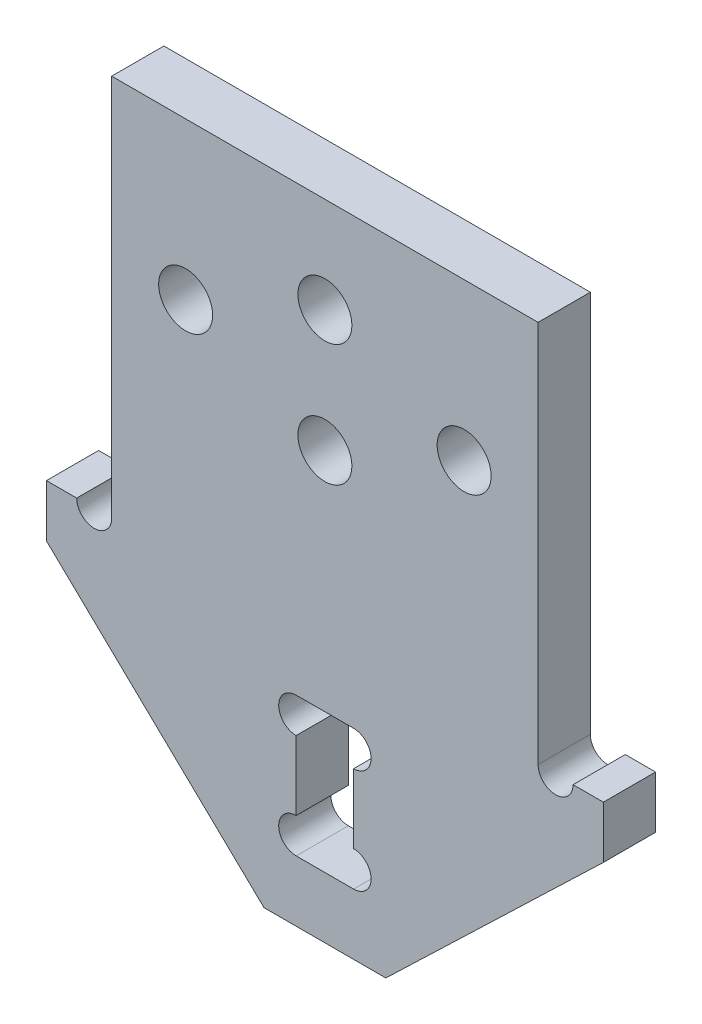
ISO-10303-21;
HEADER;
FILE_DESCRIPTION(('STEP AP214'),'2;1');
FILE_NAME('part.step','',(''),(''),'','','');
FILE_SCHEMA(('AUTOMOTIVE_DESIGN { 1 0 10303 214 1 1 1 1 }'));
ENDSEC;
DATA;
#1=APPLICATION_CONTEXT('core data for automotive mechanical design processes');
#2=APPLICATION_PROTOCOL_DEFINITION('international standard','automotive_design',2000,#1);
#3=PRODUCT_CONTEXT('',#1,'mechanical');
#4=PRODUCT('Part','Part','',(#3));
#5=PRODUCT_RELATED_PRODUCT_CATEGORY('part','',(#4));
#6=PRODUCT_DEFINITION_FORMATION('','',#4);
#7=PRODUCT_DEFINITION_CONTEXT('part definition',#1,'design');
#8=PRODUCT_DEFINITION('design','',#6,#7);
#9=PRODUCT_DEFINITION_SHAPE('','',#8);
#10=(LENGTH_UNIT() NAMED_UNIT(*) SI_UNIT(.MILLI.,.METRE.));
#11=(NAMED_UNIT(*) PLANE_ANGLE_UNIT() SI_UNIT($,.RADIAN.));
#12=(NAMED_UNIT(*) SI_UNIT($,.STERADIAN.) SOLID_ANGLE_UNIT());
#13=UNCERTAINTY_MEASURE_WITH_UNIT(LENGTH_MEASURE(1.E-05),#10,'distance_accuracy_value','');
#14=(GEOMETRIC_REPRESENTATION_CONTEXT(3) GLOBAL_UNCERTAINTY_ASSIGNED_CONTEXT((#13)) GLOBAL_UNIT_ASSIGNED_CONTEXT((#10,
#11,#12)) REPRESENTATION_CONTEXT('',''));
#15=CARTESIAN_POINT('',(0.,0.,0.));
#16=DIRECTION('',(0.,0.,1.));
#17=DIRECTION('',(1.,0.,0.));
#18=AXIS2_PLACEMENT_3D('',#15,#16,#17);
#19=CARTESIAN_POINT('',(13.255,-11.,3.));
#20=DIRECTION('',(0.,0.,-1.));
#21=DIRECTION('',(-1.,0.,0.));
#22=AXIS2_PLACEMENT_3D('',#19,#20,#21);
#23=CYLINDRICAL_SURFACE('',#22,1.005);
#24=CARTESIAN_POINT('',(13.255,-11.,0.));
#25=DIRECTION('',(0.,0.,1.));
#26=DIRECTION('',(1.,0.,0.));
#27=AXIS2_PLACEMENT_3D('',#24,#25,#26);
#28=CIRCLE('',#27,1.005);
#29=CARTESIAN_POINT('',(12.25,-11.,0.));
#30=VERTEX_POINT('',#29);
#31=CARTESIAN_POINT('',(14.26,-11.,0.));
#32=VERTEX_POINT('',#31);
#33=EDGE_CURVE('E387',#30,#32,#28,.T.);
#34=ORIENTED_EDGE('',*,*,#33,.F.);
#35=DIRECTION('',(0.,0.,-1.));
#36=VECTOR('',#35,1.);
#37=CARTESIAN_POINT('',(12.25,-11.,3.));
#38=LINE('',#37,#36);
#39=CARTESIAN_POINT('',(12.25,-11.,3.));
#40=VERTEX_POINT('',#39);
#41=EDGE_CURVE('E12',#40,#30,#38,.T.);
#42=ORIENTED_EDGE('',*,*,#41,.F.);
#43=CARTESIAN_POINT('',(13.255,-11.,3.));
#44=DIRECTION('',(0.,0.,1.));
#45=DIRECTION('',(1.,0.,0.));
#46=AXIS2_PLACEMENT_3D('',#43,#44,#45);
#47=CIRCLE('',#46,1.005);
#48=CARTESIAN_POINT('',(14.26,-11.,3.));
#49=VERTEX_POINT('',#48);
#50=EDGE_CURVE('E244',#40,#49,#47,.T.);
#51=ORIENTED_EDGE('',*,*,#50,.T.);
#52=DIRECTION('',(0.,0.,-1.));
#53=VECTOR('',#52,1.);
#54=CARTESIAN_POINT('',(14.26,-11.,3.));
#55=LINE('',#54,#53);
#56=EDGE_CURVE('E56',#49,#32,#55,.T.);
#57=ORIENTED_EDGE('',*,*,#56,.T.);
#58=EDGE_LOOP('',(#34,#42,#51,#57));
#59=FACE_BOUND('',#58,.T.);
#60=ADVANCED_FACE('F37',(#59),#23,.F.);
#61=CARTESIAN_POINT('',(12.25,0.,3.));
#62=DIRECTION('',(-1.,0.,0.));
#63=DIRECTION('',(0.,-1.,0.));
#64=AXIS2_PLACEMENT_3D('',#61,#62,#63);
#65=PLANE('',#64);
#66=DIRECTION('',(0.,1.,0.));
#67=VECTOR('',#66,1.);
#68=CARTESIAN_POINT('',(12.25,0.,0.));
#69=LINE('',#68,#67);
#70=CARTESIAN_POINT('',(12.25,11.,0.));
#71=VERTEX_POINT('',#70);
#72=EDGE_CURVE('E389',#30,#71,#69,.T.);
#73=ORIENTED_EDGE('',*,*,#72,.T.);
#74=DIRECTION('',(0.,0.,-1.));
#75=VECTOR('',#74,1.);
#76=CARTESIAN_POINT('',(12.25,11.,3.));
#77=LINE('',#76,#75);
#78=CARTESIAN_POINT('',(12.25,11.,3.));
#79=VERTEX_POINT('',#78);
#80=EDGE_CURVE('E47',#79,#71,#77,.T.);
#81=ORIENTED_EDGE('',*,*,#80,.F.);
#82=DIRECTION('',(0.,1.,0.));
#83=VECTOR('',#82,1.);
#84=CARTESIAN_POINT('',(12.25,0.,3.));
#85=LINE('',#84,#83);
#86=EDGE_CURVE('E240',#40,#79,#85,.T.);
#87=ORIENTED_EDGE('',*,*,#86,.F.);
#88=ORIENTED_EDGE('',*,*,#41,.T.);
#89=EDGE_LOOP('',(#73,#81,#87,#88));
#90=FACE_BOUND('',#89,.T.);
#91=ADVANCED_FACE('F440',(#90),#65,.F.);
#92=CARTESIAN_POINT('',(0.,11.,3.));
#93=DIRECTION('',(0.,-1.,0.));
#94=DIRECTION('',(1.,0.,0.));
#95=AXIS2_PLACEMENT_3D('',#92,#93,#94);
#96=PLANE('',#95);
#97=DIRECTION('',(-1.,0.,0.));
#98=VECTOR('',#97,1.);
#99=CARTESIAN_POINT('',(0.,11.,0.));
#100=LINE('',#99,#98);
#101=CARTESIAN_POINT('',(-12.25,11.,0.));
#102=VERTEX_POINT('',#101);
#103=EDGE_CURVE('E392',#71,#102,#100,.T.);
#104=ORIENTED_EDGE('',*,*,#103,.T.);
#105=DIRECTION('',(0.,0.,-1.));
#106=VECTOR('',#105,1.);
#107=CARTESIAN_POINT('',(-12.25,11.,3.));
#108=LINE('',#107,#106);
#109=CARTESIAN_POINT('',(-12.25,11.,3.));
#110=VERTEX_POINT('',#109);
#111=EDGE_CURVE('E329',#110,#102,#108,.T.);
#112=ORIENTED_EDGE('',*,*,#111,.F.);
#113=DIRECTION('',(-1.,0.,0.));
#114=VECTOR('',#113,1.);
#115=CARTESIAN_POINT('',(0.,11.,3.));
#116=LINE('',#115,#114);
#117=EDGE_CURVE('E237',#79,#110,#116,.T.);
#118=ORIENTED_EDGE('',*,*,#117,.F.);
#119=ORIENTED_EDGE('',*,*,#80,.T.);
#120=EDGE_LOOP('',(#104,#112,#118,#119));
#121=FACE_BOUND('',#120,.T.);
#122=ADVANCED_FACE('F437',(#121),#96,.F.);
#123=CARTESIAN_POINT('',(-12.25,0.,3.));
#124=DIRECTION('',(-1.,0.,0.));
#125=DIRECTION('',(0.,0.,1.));
#126=AXIS2_PLACEMENT_3D('',#123,#124,#125);
#127=PLANE('',#126);
#128=DIRECTION('',(0.,1.,0.));
#129=VECTOR('',#128,1.);
#130=CARTESIAN_POINT('',(-12.25,0.,0.));
#131=LINE('',#130,#129);
#132=CARTESIAN_POINT('',(-12.25,-11.,0.));
#133=VERTEX_POINT('',#132);
#134=EDGE_CURVE('E395',#133,#102,#131,.T.);
#135=ORIENTED_EDGE('',*,*,#134,.F.);
#136=DIRECTION('',(0.,0.,-1.));
#137=VECTOR('',#136,1.);
#138=CARTESIAN_POINT('',(-12.25,-11.,3.));
#139=LINE('',#138,#137);
#140=CARTESIAN_POINT('',(-12.25,-11.,3.));
#141=VERTEX_POINT('',#140);
#142=EDGE_CURVE('E327',#141,#133,#139,.T.);
#143=ORIENTED_EDGE('',*,*,#142,.F.);
#144=DIRECTION('',(0.,1.,0.));
#145=VECTOR('',#144,1.);
#146=CARTESIAN_POINT('',(-12.25,0.,3.));
#147=LINE('',#146,#145);
#148=EDGE_CURVE('E234',#141,#110,#147,.T.);
#149=ORIENTED_EDGE('',*,*,#148,.T.);
#150=ORIENTED_EDGE('',*,*,#111,.T.);
#151=EDGE_LOOP('',(#135,#143,#149,#150));
#152=FACE_BOUND('',#151,.T.);
#153=ADVANCED_FACE('F432',(#152),#127,.T.);
#154=CARTESIAN_POINT('',(-13.255,-11.,3.));
#155=DIRECTION('',(0.,0.,-1.));
#156=DIRECTION('',(-1.,0.,0.));
#157=AXIS2_PLACEMENT_3D('',#154,#155,#156);
#158=CYLINDRICAL_SURFACE('',#157,1.005);
#159=CARTESIAN_POINT('',(-13.255,-11.,0.));
#160=DIRECTION('',(0.,0.,1.));
#161=DIRECTION('',(1.,0.,0.));
#162=AXIS2_PLACEMENT_3D('',#159,#160,#161);
#163=CIRCLE('',#162,1.005);
#164=CARTESIAN_POINT('',(-14.26,-11.,0.));
#165=VERTEX_POINT('',#164);
#166=EDGE_CURVE('E398',#165,#133,#163,.T.);
#167=ORIENTED_EDGE('',*,*,#166,.F.);
#168=DIRECTION('',(0.,0.,-1.));
#169=VECTOR('',#168,1.);
#170=CARTESIAN_POINT('',(-14.26,-11.,3.));
#171=LINE('',#170,#169);
#172=CARTESIAN_POINT('',(-14.26,-11.,3.));
#173=VERTEX_POINT('',#172);
#174=EDGE_CURVE('E325',#173,#165,#171,.T.);
#175=ORIENTED_EDGE('',*,*,#174,.F.);
#176=CARTESIAN_POINT('',(-13.255,-11.,3.));
#177=DIRECTION('',(0.,0.,1.));
#178=DIRECTION('',(1.,0.,0.));
#179=AXIS2_PLACEMENT_3D('',#176,#177,#178);
#180=CIRCLE('',#179,1.005);
#181=EDGE_CURVE('E226',#173,#141,#180,.T.);
#182=ORIENTED_EDGE('',*,*,#181,.T.);
#183=ORIENTED_EDGE('',*,*,#142,.T.);
#184=EDGE_LOOP('',(#167,#175,#182,#183));
#185=FACE_BOUND('',#184,.T.);
#186=ADVANCED_FACE('F425',(#185),#158,.F.);
#187=CARTESIAN_POINT('',(0.,-11.,3.));
#188=DIRECTION('',(0.,-1.,0.));
#189=DIRECTION('',(0.,0.,-1.));
#190=AXIS2_PLACEMENT_3D('',#187,#188,#189);
#191=PLANE('',#190);
#192=DIRECTION('',(-1.,0.,0.));
#193=VECTOR('',#192,1.);
#194=CARTESIAN_POINT('',(0.,-11.,0.));
#195=LINE('',#194,#193);
#196=CARTESIAN_POINT('',(-16.,-11.,0.));
#197=VERTEX_POINT('',#196);
#198=EDGE_CURVE('E401',#165,#197,#195,.T.);
#199=ORIENTED_EDGE('',*,*,#198,.T.);
#200=DIRECTION('',(0.,0.,-1.));
#201=VECTOR('',#200,1.);
#202=CARTESIAN_POINT('',(-16.,-11.,3.));
#203=LINE('',#202,#201);
#204=CARTESIAN_POINT('',(-16.,-11.,3.));
#205=VERTEX_POINT('',#204);
#206=EDGE_CURVE('E322',#205,#197,#203,.T.);
#207=ORIENTED_EDGE('',*,*,#206,.F.);
#208=DIRECTION('',(-1.,0.,0.));
#209=VECTOR('',#208,1.);
#210=CARTESIAN_POINT('',(0.,-11.,3.));
#211=LINE('',#210,#209);
#212=EDGE_CURVE('E222',#173,#205,#211,.T.);
#213=ORIENTED_EDGE('',*,*,#212,.F.);
#214=ORIENTED_EDGE('',*,*,#174,.T.);
#215=EDGE_LOOP('',(#199,#207,#213,#214));
#216=FACE_BOUND('',#215,.T.);
#217=ADVANCED_FACE('F511',(#216),#191,.F.);
#218=CARTESIAN_POINT('',(-16.,0.,3.));
#219=DIRECTION('',(1.,0.,0.));
#220=DIRECTION('',(0.,0.,-1.));
#221=AXIS2_PLACEMENT_3D('',#218,#219,#220);
#222=PLANE('',#221);
#223=DIRECTION('',(0.,-1.,0.));
#224=VECTOR('',#223,1.);
#225=CARTESIAN_POINT('',(-16.,0.,0.));
#226=LINE('',#225,#224);
#227=CARTESIAN_POINT('',(-16.,-14.,0.));
#228=VERTEX_POINT('',#227);
#229=EDGE_CURVE('E404',#197,#228,#226,.T.);
#230=ORIENTED_EDGE('',*,*,#229,.T.);
#231=DIRECTION('',(0.,0.,-1.));
#232=VECTOR('',#231,1.);
#233=CARTESIAN_POINT('',(-16.,-14.,3.));
#234=LINE('',#233,#232);
#235=CARTESIAN_POINT('',(-16.,-14.,3.));
#236=VERTEX_POINT('',#235);
#237=EDGE_CURVE('E319',#236,#228,#234,.T.);
#238=ORIENTED_EDGE('',*,*,#237,.F.);
#239=DIRECTION('',(0.,-1.,0.));
#240=VECTOR('',#239,1.);
#241=CARTESIAN_POINT('',(-16.,0.,3.));
#242=LINE('',#241,#240);
#243=EDGE_CURVE('E218',#205,#236,#242,.T.);
#244=ORIENTED_EDGE('',*,*,#243,.F.);
#245=ORIENTED_EDGE('',*,*,#206,.T.);
#246=EDGE_LOOP('',(#230,#238,#244,#245));
#247=FACE_BOUND('',#246,.T.);
#248=ADVANCED_FACE('F419',(#247),#222,.F.);
#249=CARTESIAN_POINT('',(-14.6677768526228,-15.2789342214821,3.));
#250=DIRECTION('',(0.692531828189713,0.721387321030952,0.));
#251=DIRECTION('',(-0.721387321030952,0.692531828189713,0.));
#252=AXIS2_PLACEMENT_3D('',#249,#250,#251);
#253=PLANE('',#252);
#254=DIRECTION('',(0.721387321030952,-0.692531828189713,0.));
#255=VECTOR('',#254,1.);
#256=CARTESIAN_POINT('',(-14.6677768526228,-15.2789342214821,0.));
#257=LINE('',#256,#255);
#258=CARTESIAN_POINT('',(-3.49999999999999,-26.,0.));
#259=VERTEX_POINT('',#258);
#260=EDGE_CURVE('E407',#228,#259,#257,.T.);
#261=ORIENTED_EDGE('',*,*,#260,.T.);
#262=DIRECTION('',(0.,0.,-1.));
#263=VECTOR('',#262,1.);
#264=CARTESIAN_POINT('',(-3.49999999999999,-26.,3.));
#265=LINE('',#264,#263);
#266=CARTESIAN_POINT('',(-3.49999999999999,-26.,3.));
#267=VERTEX_POINT('',#266);
#268=EDGE_CURVE('E316',#267,#259,#265,.T.);
#269=ORIENTED_EDGE('',*,*,#268,.F.);
#270=DIRECTION('',(0.721387321030952,-0.692531828189713,0.));
#271=VECTOR('',#270,1.);
#272=CARTESIAN_POINT('',(-14.6677768526228,-15.2789342214821,3.));
#273=LINE('',#272,#271);
#274=EDGE_CURVE('E205',#236,#267,#273,.T.);
#275=ORIENTED_EDGE('',*,*,#274,.F.);
#276=ORIENTED_EDGE('',*,*,#237,.T.);
#277=EDGE_LOOP('',(#261,#269,#275,#276));
#278=FACE_BOUND('',#277,.T.);
#279=ADVANCED_FACE('F416',(#278),#253,.F.);
#280=CARTESIAN_POINT('',(0.,-26.,3.));
#281=DIRECTION('',(0.,1.,0.));
#282=DIRECTION('',(0.,0.,1.));
#283=AXIS2_PLACEMENT_3D('',#280,#281,#282);
#284=PLANE('',#283);
#285=DIRECTION('',(1.,0.,0.));
#286=VECTOR('',#285,1.);
#287=CARTESIAN_POINT('',(0.,-26.,0.));
#288=LINE('',#287,#286);
#289=CARTESIAN_POINT('',(3.5,-26.,0.));
#290=VERTEX_POINT('',#289);
#291=EDGE_CURVE('E410',#259,#290,#288,.T.);
#292=ORIENTED_EDGE('',*,*,#291,.T.);
#293=DIRECTION('',(0.,0.,-1.));
#294=VECTOR('',#293,1.);
#295=CARTESIAN_POINT('',(3.5,-26.,3.));
#296=LINE('',#295,#294);
#297=CARTESIAN_POINT('',(3.5,-26.,3.));
#298=VERTEX_POINT('',#297);
#299=EDGE_CURVE('E191',#298,#290,#296,.T.);
#300=ORIENTED_EDGE('',*,*,#299,.F.);
#301=DIRECTION('',(1.,0.,0.));
#302=VECTOR('',#301,1.);
#303=CARTESIAN_POINT('',(0.,-26.,3.));
#304=LINE('',#303,#302);
#305=EDGE_CURVE('E202',#267,#298,#304,.T.);
#306=ORIENTED_EDGE('',*,*,#305,.F.);
#307=ORIENTED_EDGE('',*,*,#268,.T.);
#308=EDGE_LOOP('',(#292,#300,#306,#307));
#309=FACE_BOUND('',#308,.T.);
#310=ADVANCED_FACE('F414',(#309),#284,.F.);
#311=CARTESIAN_POINT('',(14.6677768526228,-15.2789342214821,3.));
#312=DIRECTION('',(0.692531828189713,-0.721387321030951,0.));
#313=DIRECTION('',(0.721387321030952,0.692531828189713,0.));
#314=AXIS2_PLACEMENT_3D('',#311,#312,#313);
#315=PLANE('',#314);
#316=DIRECTION('',(-0.721387321030952,-0.692531828189713,0.));
#317=VECTOR('',#316,1.);
#318=CARTESIAN_POINT('',(14.6677768526228,-15.2789342214821,0.));
#319=LINE('',#318,#317);
#320=CARTESIAN_POINT('',(16.,-14.,0.));
#321=VERTEX_POINT('',#320);
#322=EDGE_CURVE('E188',#321,#290,#319,.T.);
#323=ORIENTED_EDGE('',*,*,#322,.F.);
#324=DIRECTION('',(0.,0.,-1.));
#325=VECTOR('',#324,1.);
#326=CARTESIAN_POINT('',(16.,-14.,3.));
#327=LINE('',#326,#325);
#328=CARTESIAN_POINT('',(16.,-14.,3.));
#329=VERTEX_POINT('',#328);
#330=EDGE_CURVE('E182',#329,#321,#327,.T.);
#331=ORIENTED_EDGE('',*,*,#330,.F.);
#332=DIRECTION('',(-0.721387321030952,-0.692531828189713,0.));
#333=VECTOR('',#332,1.);
#334=CARTESIAN_POINT('',(14.6677768526228,-15.2789342214821,3.));
#335=LINE('',#334,#333);
#336=EDGE_CURVE('E186',#329,#298,#335,.T.);
#337=ORIENTED_EDGE('',*,*,#336,.T.);
#338=ORIENTED_EDGE('',*,*,#299,.T.);
#339=EDGE_LOOP('',(#323,#331,#337,#338));
#340=FACE_BOUND('',#339,.T.);
#341=ADVANCED_FACE('F184',(#340),#315,.T.);
#342=CARTESIAN_POINT('',(16.,0.,3.));
#343=DIRECTION('',(-1.,0.,0.));
#344=DIRECTION('',(0.,0.,1.));
#345=AXIS2_PLACEMENT_3D('',#342,#343,#344);
#346=PLANE('',#345);
#347=DIRECTION('',(0.,1.,0.));
#348=VECTOR('',#347,1.);
#349=CARTESIAN_POINT('',(16.,0.,0.));
#350=LINE('',#349,#348);
#351=CARTESIAN_POINT('',(16.,-11.,0.));
#352=VERTEX_POINT('',#351);
#353=EDGE_CURVE('E307',#321,#352,#350,.T.);
#354=ORIENTED_EDGE('',*,*,#353,.T.);
#355=DIRECTION('',(0.,0.,-1.));
#356=VECTOR('',#355,1.);
#357=CARTESIAN_POINT('',(16.,-11.,3.));
#358=LINE('',#357,#356);
#359=CARTESIAN_POINT('',(16.,-11.,3.));
#360=VERTEX_POINT('',#359);
#361=EDGE_CURVE('E118',#360,#352,#358,.T.);
#362=ORIENTED_EDGE('',*,*,#361,.F.);
#363=DIRECTION('',(0.,1.,0.));
#364=VECTOR('',#363,1.);
#365=CARTESIAN_POINT('',(16.,0.,3.));
#366=LINE('',#365,#364);
#367=EDGE_CURVE('E193',#329,#360,#366,.T.);
#368=ORIENTED_EDGE('',*,*,#367,.F.);
#369=ORIENTED_EDGE('',*,*,#330,.T.);
#370=EDGE_LOOP('',(#354,#362,#368,#369));
#371=FACE_BOUND('',#370,.T.);
#372=ADVANCED_FACE('F194',(#371),#346,.F.);
#373=CARTESIAN_POINT('',(1.65,-21.495,3.));
#374=DIRECTION('',(0.,0.,-1.));
#375=DIRECTION('',(-1.,0.,0.));
#376=AXIS2_PLACEMENT_3D('',#373,#374,#375);
#377=CYLINDRICAL_SURFACE('',#376,1.005);
#378=CARTESIAN_POINT('',(1.65,-21.495,0.));
#379=DIRECTION('',(0.,0.,1.));
#380=DIRECTION('',(1.,0.,0.));
#381=AXIS2_PLACEMENT_3D('',#378,#379,#380);
#382=CIRCLE('',#381,1.005);
#383=CARTESIAN_POINT('',(1.65,-22.5,0.));
#384=VERTEX_POINT('',#383);
#385=CARTESIAN_POINT('',(1.65,-20.49,0.));
#386=VERTEX_POINT('',#385);
#387=EDGE_CURVE('E359',#384,#386,#382,.T.);
#388=ORIENTED_EDGE('',*,*,#387,.F.);
#389=DIRECTION('',(0.,0.,-1.));
#390=VECTOR('',#389,1.);
#391=CARTESIAN_POINT('',(1.65,-22.5,3.));
#392=LINE('',#391,#390);
#393=CARTESIAN_POINT('',(1.65,-22.5,3.));
#394=VERTEX_POINT('',#393);
#395=EDGE_CURVE('E41',#394,#384,#392,.T.);
#396=ORIENTED_EDGE('',*,*,#395,.F.);
#397=CARTESIAN_POINT('',(1.65,-21.495,3.));
#398=DIRECTION('',(0.,0.,1.));
#399=DIRECTION('',(1.,0.,0.));
#400=AXIS2_PLACEMENT_3D('',#397,#398,#399);
#401=CIRCLE('',#400,1.005);
#402=CARTESIAN_POINT('',(1.65,-20.49,3.));
#403=VERTEX_POINT('',#402);
#404=EDGE_CURVE('E280',#394,#403,#401,.T.);
#405=ORIENTED_EDGE('',*,*,#404,.T.);
#406=DIRECTION('',(0.,0.,-1.));
#407=VECTOR('',#406,1.);
#408=CARTESIAN_POINT('',(1.65,-20.49,3.));
#409=LINE('',#408,#407);
#410=EDGE_CURVE('E333',#403,#386,#409,.T.);
#411=ORIENTED_EDGE('',*,*,#410,.T.);
#412=EDGE_LOOP('',(#388,#396,#405,#411));
#413=FACE_BOUND('',#412,.T.);
#414=ADVANCED_FACE('F364',(#413),#377,.F.);
#415=CARTESIAN_POINT('',(0.,-22.5,3.));
#416=DIRECTION('',(0.,-1.,0.));
#417=DIRECTION('',(0.,0.,-1.));
#418=AXIS2_PLACEMENT_3D('',#415,#416,#417);
#419=PLANE('',#418);
#420=DIRECTION('',(-1.,0.,0.));
#421=VECTOR('',#420,1.);
#422=CARTESIAN_POINT('',(0.,-22.5,0.));
#423=LINE('',#422,#421);
#424=CARTESIAN_POINT('',(-1.65,-22.5,0.));
#425=VERTEX_POINT('',#424);
#426=EDGE_CURVE('E352',#384,#425,#423,.T.);
#427=ORIENTED_EDGE('',*,*,#426,.T.);
#428=DIRECTION('',(0.,0.,-1.));
#429=VECTOR('',#428,1.);
#430=CARTESIAN_POINT('',(-1.65,-22.5,3.));
#431=LINE('',#430,#429);
#432=CARTESIAN_POINT('',(-1.65,-22.5,3.));
#433=VERTEX_POINT('',#432);
#434=EDGE_CURVE('E344',#433,#425,#431,.T.);
#435=ORIENTED_EDGE('',*,*,#434,.F.);
#436=DIRECTION('',(-1.,0.,0.));
#437=VECTOR('',#436,1.);
#438=CARTESIAN_POINT('',(0.,-22.5,3.));
#439=LINE('',#438,#437);
#440=EDGE_CURVE('E277',#394,#433,#439,.T.);
#441=ORIENTED_EDGE('',*,*,#440,.F.);
#442=ORIENTED_EDGE('',*,*,#395,.T.);
#443=EDGE_LOOP('',(#427,#435,#441,#442));
#444=FACE_BOUND('',#443,.T.);
#445=ADVANCED_FACE('F351',(#444),#419,.F.);
#446=CARTESIAN_POINT('',(-1.65,-21.495,3.));
#447=DIRECTION('',(0.,0.,-1.));
#448=DIRECTION('',(-1.,0.,0.));
#449=AXIS2_PLACEMENT_3D('',#446,#447,#448);
#450=CYLINDRICAL_SURFACE('',#449,1.005);
#451=CARTESIAN_POINT('',(-1.65,-21.495,0.));
#452=DIRECTION('',(0.,0.,1.));
#453=DIRECTION('',(1.,0.,0.));
#454=AXIS2_PLACEMENT_3D('',#451,#452,#453);
#455=CIRCLE('',#454,1.005);
#456=CARTESIAN_POINT('',(-1.65,-20.49,0.));
#457=VERTEX_POINT('',#456);
#458=EDGE_CURVE('E362',#457,#425,#455,.T.);
#459=ORIENTED_EDGE('',*,*,#458,.F.);
#460=DIRECTION('',(0.,0.,-1.));
#461=VECTOR('',#460,1.);
#462=CARTESIAN_POINT('',(-1.65,-20.49,3.));
#463=LINE('',#462,#461);
#464=CARTESIAN_POINT('',(-1.65,-20.49,3.));
#465=VERTEX_POINT('',#464);
#466=EDGE_CURVE('E343',#465,#457,#463,.T.);
#467=ORIENTED_EDGE('',*,*,#466,.F.);
#468=CARTESIAN_POINT('',(-1.65,-21.495,3.));
#469=DIRECTION('',(0.,0.,1.));
#470=DIRECTION('',(1.,0.,0.));
#471=AXIS2_PLACEMENT_3D('',#468,#469,#470);
#472=CIRCLE('',#471,1.005);
#473=EDGE_CURVE('E273',#465,#433,#472,.T.);
#474=ORIENTED_EDGE('',*,*,#473,.T.);
#475=ORIENTED_EDGE('',*,*,#434,.T.);
#476=EDGE_LOOP('',(#459,#467,#474,#475));
#477=FACE_BOUND('',#476,.T.);
#478=ADVANCED_FACE('F481',(#477),#450,.F.);
#479=CARTESIAN_POINT('',(-1.65,0.,3.));
#480=DIRECTION('',(-1.,0.,0.));
#481=DIRECTION('',(0.,-1.,0.));
#482=AXIS2_PLACEMENT_3D('',#479,#480,#481);
#483=PLANE('',#482);
#484=DIRECTION('',(0.,1.,0.));
#485=VECTOR('',#484,1.);
#486=CARTESIAN_POINT('',(-1.65,0.,0.));
#487=LINE('',#486,#485);
#488=CARTESIAN_POINT('',(-1.65,-16.51,0.));
#489=VERTEX_POINT('',#488);
#490=EDGE_CURVE('E373',#457,#489,#487,.T.);
#491=ORIENTED_EDGE('',*,*,#490,.T.);
#492=DIRECTION('',(0.,0.,-1.));
#493=VECTOR('',#492,1.);
#494=CARTESIAN_POINT('',(-1.65,-16.51,3.));
#495=LINE('',#494,#493);
#496=CARTESIAN_POINT('',(-1.65,-16.51,3.));
#497=VERTEX_POINT('',#496);
#498=EDGE_CURVE('E341',#497,#489,#495,.T.);
#499=ORIENTED_EDGE('',*,*,#498,.F.);
#500=DIRECTION('',(0.,1.,0.));
#501=VECTOR('',#500,1.);
#502=CARTESIAN_POINT('',(-1.65,0.,3.));
#503=LINE('',#502,#501);
#504=EDGE_CURVE('E271',#465,#497,#503,.T.);
#505=ORIENTED_EDGE('',*,*,#504,.F.);
#506=ORIENTED_EDGE('',*,*,#466,.T.);
#507=EDGE_LOOP('',(#491,#499,#505,#506));
#508=FACE_BOUND('',#507,.T.);
#509=ADVANCED_FACE('F477',(#508),#483,.F.);
#510=CARTESIAN_POINT('',(-1.65,-15.505,3.));
#511=DIRECTION('',(0.,0.,-1.));
#512=DIRECTION('',(-1.,0.,0.));
#513=AXIS2_PLACEMENT_3D('',#510,#511,#512);
#514=CYLINDRICAL_SURFACE('',#513,1.005);
#515=CARTESIAN_POINT('',(-1.65,-15.505,0.));
#516=DIRECTION('',(0.,0.,1.));
#517=DIRECTION('',(1.,0.,0.));
#518=AXIS2_PLACEMENT_3D('',#515,#516,#517);
#519=CIRCLE('',#518,1.005);
#520=CARTESIAN_POINT('',(-1.65,-14.5,0.));
#521=VERTEX_POINT('',#520);
#522=EDGE_CURVE('E376',#521,#489,#519,.T.);
#523=ORIENTED_EDGE('',*,*,#522,.F.);
#524=DIRECTION('',(0.,0.,-1.));
#525=VECTOR('',#524,1.);
#526=CARTESIAN_POINT('',(-1.65,-14.5,3.));
#527=LINE('',#526,#525);
#528=CARTESIAN_POINT('',(-1.65,-14.5,3.));
#529=VERTEX_POINT('',#528);
#530=EDGE_CURVE('E339',#529,#521,#527,.T.);
#531=ORIENTED_EDGE('',*,*,#530,.F.);
#532=CARTESIAN_POINT('',(-1.65,-15.505,3.));
#533=DIRECTION('',(0.,0.,1.));
#534=DIRECTION('',(1.,0.,0.));
#535=AXIS2_PLACEMENT_3D('',#532,#533,#534);
#536=CIRCLE('',#535,1.005);
#537=EDGE_CURVE('E263',#529,#497,#536,.T.);
#538=ORIENTED_EDGE('',*,*,#537,.T.);
#539=ORIENTED_EDGE('',*,*,#498,.T.);
#540=EDGE_LOOP('',(#523,#531,#538,#539));
#541=FACE_BOUND('',#540,.T.);
#542=ADVANCED_FACE('F473',(#541),#514,.F.);
#543=CARTESIAN_POINT('',(0.,-14.5,3.));
#544=DIRECTION('',(0.,-1.,0.));
#545=DIRECTION('',(1.,0.,0.));
#546=AXIS2_PLACEMENT_3D('',#543,#544,#545);
#547=PLANE('',#546);
#548=DIRECTION('',(-1.,0.,0.));
#549=VECTOR('',#548,1.);
#550=CARTESIAN_POINT('',(0.,-14.5,0.));
#551=LINE('',#550,#549);
#552=CARTESIAN_POINT('',(1.65,-14.5,0.));
#553=VERTEX_POINT('',#552);
#554=EDGE_CURVE('E379',#553,#521,#551,.T.);
#555=ORIENTED_EDGE('',*,*,#554,.F.);
#556=DIRECTION('',(0.,0.,-1.));
#557=VECTOR('',#556,1.);
#558=CARTESIAN_POINT('',(1.65,-14.5,3.));
#559=LINE('',#558,#557);
#560=CARTESIAN_POINT('',(1.65,-14.5,3.));
#561=VERTEX_POINT('',#560);
#562=EDGE_CURVE('E337',#561,#553,#559,.T.);
#563=ORIENTED_EDGE('',*,*,#562,.F.);
#564=DIRECTION('',(-1.,0.,0.));
#565=VECTOR('',#564,1.);
#566=CARTESIAN_POINT('',(0.,-14.5,3.));
#567=LINE('',#566,#565);
#568=EDGE_CURVE('E259',#561,#529,#567,.T.);
#569=ORIENTED_EDGE('',*,*,#568,.T.);
#570=ORIENTED_EDGE('',*,*,#530,.T.);
#571=EDGE_LOOP('',(#555,#563,#569,#570));
#572=FACE_BOUND('',#571,.T.);
#573=ADVANCED_FACE('F469',(#572),#547,.T.);
#574=CARTESIAN_POINT('',(1.65,-15.505,3.));
#575=DIRECTION('',(0.,0.,-1.));
#576=DIRECTION('',(-1.,0.,0.));
#577=AXIS2_PLACEMENT_3D('',#574,#575,#576);
#578=CYLINDRICAL_SURFACE('',#577,1.005);
#579=CARTESIAN_POINT('',(1.65,-15.505,0.));
#580=DIRECTION('',(0.,0.,1.));
#581=DIRECTION('',(1.,0.,0.));
#582=AXIS2_PLACEMENT_3D('',#579,#580,#581);
#583=CIRCLE('',#582,1.005);
#584=CARTESIAN_POINT('',(1.65,-16.51,0.));
#585=VERTEX_POINT('',#584);
#586=EDGE_CURVE('E382',#585,#553,#583,.T.);
#587=ORIENTED_EDGE('',*,*,#586,.F.);
#588=DIRECTION('',(0.,0.,-1.));
#589=VECTOR('',#588,1.);
#590=CARTESIAN_POINT('',(1.65,-16.51,3.));
#591=LINE('',#590,#589);
#592=CARTESIAN_POINT('',(1.65,-16.51,3.));
#593=VERTEX_POINT('',#592);
#594=EDGE_CURVE('E335',#593,#585,#591,.T.);
#595=ORIENTED_EDGE('',*,*,#594,.F.);
#596=CARTESIAN_POINT('',(1.65,-15.505,3.));
#597=DIRECTION('',(0.,0.,1.));
#598=DIRECTION('',(1.,0.,0.));
#599=AXIS2_PLACEMENT_3D('',#596,#597,#598);
#600=CIRCLE('',#599,1.005);
#601=EDGE_CURVE('E255',#593,#561,#600,.T.);
#602=ORIENTED_EDGE('',*,*,#601,.T.);
#603=ORIENTED_EDGE('',*,*,#562,.T.);
#604=EDGE_LOOP('',(#587,#595,#602,#603));
#605=FACE_BOUND('',#604,.T.);
#606=ADVANCED_FACE('F465',(#605),#578,.F.);
#607=CARTESIAN_POINT('',(1.65,0.,3.));
#608=DIRECTION('',(-1.,0.,0.));
#609=DIRECTION('',(0.,0.,1.));
#610=AXIS2_PLACEMENT_3D('',#607,#608,#609);
#611=PLANE('',#610);
#612=DIRECTION('',(0.,1.,0.));
#613=VECTOR('',#612,1.);
#614=CARTESIAN_POINT('',(1.65,0.,0.));
#615=LINE('',#614,#613);
#616=EDGE_CURVE('E385',#386,#585,#615,.T.);
#617=ORIENTED_EDGE('',*,*,#616,.F.);
#618=ORIENTED_EDGE('',*,*,#410,.F.);
#619=DIRECTION('',(0.,1.,0.));
#620=VECTOR('',#619,1.);
#621=CARTESIAN_POINT('',(1.65,0.,3.));
#622=LINE('',#621,#620);
#623=EDGE_CURVE('E252',#403,#593,#622,.T.);
#624=ORIENTED_EDGE('',*,*,#623,.T.);
#625=ORIENTED_EDGE('',*,*,#594,.T.);
#626=EDGE_LOOP('',(#617,#618,#624,#625));
#627=FACE_BOUND('',#626,.T.);
#628=ADVANCED_FACE('F461',(#627),#611,.T.);
#629=CARTESIAN_POINT('',(0.,5.49999999999999,3.));
#630=DIRECTION('',(0.,0.,-1.));
#631=DIRECTION('',(-1.,0.,0.));
#632=AXIS2_PLACEMENT_3D('',#629,#630,#631);
#633=CYLINDRICAL_SURFACE('',#632,1.55);
#634=CARTESIAN_POINT('',(0.,5.49999999999999,3.));
#635=DIRECTION('',(0.,0.,1.));
#636=DIRECTION('',(1.,0.,0.));
#637=AXIS2_PLACEMENT_3D('',#634,#635,#636);
#638=CIRCLE('',#637,1.55);
#639=CARTESIAN_POINT('',(1.55,5.49999999999999,3.));
#640=VERTEX_POINT('',#639);
#641=EDGE_CURVE('E288',#640,#640,#638,.T.);
#642=ORIENTED_EDGE('',*,*,#641,.T.);
#643=EDGE_LOOP('',(#642));
#644=FACE_BOUND('',#643,.T.);
#645=CARTESIAN_POINT('',(0.,5.49999999999999,0.));
#646=DIRECTION('',(0.,0.,1.));
#647=DIRECTION('',(1.,0.,0.));
#648=AXIS2_PLACEMENT_3D('',#645,#646,#647);
#649=CIRCLE('',#648,1.55);
#650=CARTESIAN_POINT('',(1.55,5.49999999999999,0.));
#651=VERTEX_POINT('',#650);
#652=EDGE_CURVE('E365',#651,#651,#649,.T.);
#653=ORIENTED_EDGE('',*,*,#652,.F.);
#654=EDGE_LOOP('',(#653));
#655=FACE_BOUND('',#654,.T.);
#656=ADVANCED_FACE('F464',(#644,#655),#633,.F.);
#657=CARTESIAN_POINT('',(0.,-1.50000000000001,3.));
#658=DIRECTION('',(0.,0.,-1.));
#659=DIRECTION('',(-1.,0.,0.));
#660=AXIS2_PLACEMENT_3D('',#657,#658,#659);
#661=CYLINDRICAL_SURFACE('',#660,1.55);
#662=CARTESIAN_POINT('',(0.,-1.50000000000001,3.));
#663=DIRECTION('',(0.,0.,1.));
#664=DIRECTION('',(1.,0.,0.));
#665=AXIS2_PLACEMENT_3D('',#662,#663,#664);
#666=CIRCLE('',#665,1.55);
#667=CARTESIAN_POINT('',(1.55,-1.50000000000001,3.));
#668=VERTEX_POINT('',#667);
#669=EDGE_CURVE('E291',#668,#668,#666,.T.);
#670=ORIENTED_EDGE('',*,*,#669,.T.);
#671=EDGE_LOOP('',(#670));
#672=FACE_BOUND('',#671,.T.);
#673=CARTESIAN_POINT('',(0.,-1.50000000000001,0.));
#674=DIRECTION('',(0.,0.,1.));
#675=DIRECTION('',(1.,0.,0.));
#676=AXIS2_PLACEMENT_3D('',#673,#674,#675);
#677=CIRCLE('',#676,1.55);
#678=CARTESIAN_POINT('',(1.55,-1.50000000000001,0.));
#679=VERTEX_POINT('',#678);
#680=EDGE_CURVE('E368',#679,#679,#677,.T.);
#681=ORIENTED_EDGE('',*,*,#680,.F.);
#682=EDGE_LOOP('',(#681));
#683=FACE_BOUND('',#682,.T.);
#684=ADVANCED_FACE('F491',(#672,#683),#661,.F.);
#685=CARTESIAN_POINT('',(8.,1.99999999999999,3.));
#686=DIRECTION('',(0.,0.,-1.));
#687=DIRECTION('',(-1.,0.,0.));
#688=AXIS2_PLACEMENT_3D('',#685,#686,#687);
#689=CYLINDRICAL_SURFACE('',#688,1.55);
#690=CARTESIAN_POINT('',(8.,1.99999999999999,3.));
#691=DIRECTION('',(0.,0.,1.));
#692=DIRECTION('',(1.,0.,0.));
#693=AXIS2_PLACEMENT_3D('',#690,#691,#692);
#694=CIRCLE('',#693,1.55);
#695=CARTESIAN_POINT('',(9.55,1.99999999999999,3.));
#696=VERTEX_POINT('',#695);
#697=EDGE_CURVE('E295',#696,#696,#694,.T.);
#698=ORIENTED_EDGE('',*,*,#697,.T.);
#699=EDGE_LOOP('',(#698));
#700=FACE_BOUND('',#699,.T.);
#701=CARTESIAN_POINT('',(8.,1.99999999999999,0.));
#702=DIRECTION('',(0.,0.,1.));
#703=DIRECTION('',(1.,0.,0.));
#704=AXIS2_PLACEMENT_3D('',#701,#702,#703);
#705=CIRCLE('',#704,1.55);
#706=CARTESIAN_POINT('',(9.55,1.99999999999999,0.));
#707=VERTEX_POINT('',#706);
#708=EDGE_CURVE('E503',#707,#707,#705,.T.);
#709=ORIENTED_EDGE('',*,*,#708,.F.);
#710=EDGE_LOOP('',(#709));
#711=FACE_BOUND('',#710,.T.);
#712=ADVANCED_FACE('F450',(#700,#711),#689,.F.);
#713=CARTESIAN_POINT('',(-8.,1.99999999999999,3.));
#714=DIRECTION('',(0.,0.,-1.));
#715=DIRECTION('',(-1.,0.,0.));
#716=AXIS2_PLACEMENT_3D('',#713,#714,#715);
#717=CYLINDRICAL_SURFACE('',#716,1.55);
#718=CARTESIAN_POINT('',(-8.,1.99999999999999,3.));
#719=DIRECTION('',(0.,0.,1.));
#720=DIRECTION('',(1.,0.,0.));
#721=AXIS2_PLACEMENT_3D('',#718,#719,#720);
#722=CIRCLE('',#721,1.55);
#723=CARTESIAN_POINT('',(-6.45,1.99999999999999,3.));
#724=VERTEX_POINT('',#723);
#725=EDGE_CURVE('E299',#724,#724,#722,.T.);
#726=ORIENTED_EDGE('',*,*,#725,.T.);
#727=EDGE_LOOP('',(#726));
#728=FACE_BOUND('',#727,.T.);
#729=CARTESIAN_POINT('',(-8.,1.99999999999999,0.));
#730=DIRECTION('',(0.,0.,1.));
#731=DIRECTION('',(1.,0.,0.));
#732=AXIS2_PLACEMENT_3D('',#729,#730,#731);
#733=CIRCLE('',#732,1.55);
#734=CARTESIAN_POINT('',(-6.45,1.99999999999999,0.));
#735=VERTEX_POINT('',#734);
#736=EDGE_CURVE('E505',#735,#735,#733,.T.);
#737=ORIENTED_EDGE('',*,*,#736,.F.);
#738=EDGE_LOOP('',(#737));
#739=FACE_BOUND('',#738,.T.);
#740=ADVANCED_FACE('F39',(#728,#739),#717,.F.);
#741=CARTESIAN_POINT('',(0.,-11.,3.));
#742=DIRECTION('',(0.,1.,0.));
#743=DIRECTION('',(0.,0.,1.));
#744=AXIS2_PLACEMENT_3D('',#741,#742,#743);
#745=PLANE('',#744);
#746=DIRECTION('',(1.,0.,0.));
#747=VECTOR('',#746,1.);
#748=CARTESIAN_POINT('',(0.,-11.,0.));
#749=LINE('',#748,#747);
#750=EDGE_CURVE('E303',#32,#352,#749,.T.);
#751=ORIENTED_EDGE('',*,*,#750,.F.);
#752=ORIENTED_EDGE('',*,*,#56,.F.);
#753=DIRECTION('',(1.,0.,0.));
#754=VECTOR('',#753,1.);
#755=CARTESIAN_POINT('',(0.,-11.,3.));
#756=LINE('',#755,#754);
#757=EDGE_CURVE('E197',#49,#360,#756,.T.);
#758=ORIENTED_EDGE('',*,*,#757,.T.);
#759=ORIENTED_EDGE('',*,*,#361,.T.);
#760=EDGE_LOOP('',(#751,#752,#758,#759));
#761=FACE_BOUND('',#760,.T.);
#762=ADVANCED_FACE('F441',(#761),#745,.T.);
#763=CARTESIAN_POINT('',(0.,0.,3.));
#764=DIRECTION('',(0.,0.,1.));
#765=DIRECTION('',(1.,0.,0.));
#766=AXIS2_PLACEMENT_3D('',#763,#764,#765);
#767=PLANE('',#766);
#768=ORIENTED_EDGE('',*,*,#725,.F.);
#769=EDGE_LOOP('',(#768));
#770=FACE_BOUND('',#769,.T.);
#771=ORIENTED_EDGE('',*,*,#697,.F.);
#772=EDGE_LOOP('',(#771));
#773=FACE_BOUND('',#772,.T.);
#774=ORIENTED_EDGE('',*,*,#669,.F.);
#775=EDGE_LOOP('',(#774));
#776=FACE_BOUND('',#775,.T.);
#777=ORIENTED_EDGE('',*,*,#641,.F.);
#778=EDGE_LOOP('',(#777));
#779=FACE_BOUND('',#778,.T.);
#780=ORIENTED_EDGE('',*,*,#404,.F.);
#781=ORIENTED_EDGE('',*,*,#440,.T.);
#782=ORIENTED_EDGE('',*,*,#473,.F.);
#783=ORIENTED_EDGE('',*,*,#504,.T.);
#784=ORIENTED_EDGE('',*,*,#537,.F.);
#785=ORIENTED_EDGE('',*,*,#568,.F.);
#786=ORIENTED_EDGE('',*,*,#601,.F.);
#787=ORIENTED_EDGE('',*,*,#623,.F.);
#788=EDGE_LOOP('',(#780,#781,#782,#783,#784,#785,#786,#787));
#789=FACE_BOUND('',#788,.T.);
#790=ORIENTED_EDGE('',*,*,#50,.F.);
#791=ORIENTED_EDGE('',*,*,#86,.T.);
#792=ORIENTED_EDGE('',*,*,#117,.T.);
#793=ORIENTED_EDGE('',*,*,#148,.F.);
#794=ORIENTED_EDGE('',*,*,#181,.F.);
#795=ORIENTED_EDGE('',*,*,#212,.T.);
#796=ORIENTED_EDGE('',*,*,#243,.T.);
#797=ORIENTED_EDGE('',*,*,#274,.T.);
#798=ORIENTED_EDGE('',*,*,#305,.T.);
#799=ORIENTED_EDGE('',*,*,#336,.F.);
#800=ORIENTED_EDGE('',*,*,#367,.T.);
#801=ORIENTED_EDGE('',*,*,#757,.F.);
#802=EDGE_LOOP('',(#790,#791,#792,#793,#794,#795,#796,#797,#798,#799,#800,#801));
#803=FACE_BOUND('',#802,.T.);
#804=ADVANCED_FACE('F200',(#770,#773,#776,#779,#789,#803),#767,.T.);
#805=CARTESIAN_POINT('',(0.,0.,0.));
#806=DIRECTION('',(0.,0.,1.));
#807=DIRECTION('',(1.,0.,0.));
#808=AXIS2_PLACEMENT_3D('',#805,#806,#807);
#809=PLANE('',#808);
#810=ORIENTED_EDGE('',*,*,#736,.T.);
#811=EDGE_LOOP('',(#810));
#812=FACE_BOUND('',#811,.T.);
#813=ORIENTED_EDGE('',*,*,#708,.T.);
#814=EDGE_LOOP('',(#813));
#815=FACE_BOUND('',#814,.T.);
#816=ORIENTED_EDGE('',*,*,#680,.T.);
#817=EDGE_LOOP('',(#816));
#818=FACE_BOUND('',#817,.T.);
#819=ORIENTED_EDGE('',*,*,#652,.T.);
#820=EDGE_LOOP('',(#819));
#821=FACE_BOUND('',#820,.T.);
#822=ORIENTED_EDGE('',*,*,#387,.T.);
#823=ORIENTED_EDGE('',*,*,#616,.T.);
#824=ORIENTED_EDGE('',*,*,#586,.T.);
#825=ORIENTED_EDGE('',*,*,#554,.T.);
#826=ORIENTED_EDGE('',*,*,#522,.T.);
#827=ORIENTED_EDGE('',*,*,#490,.F.);
#828=ORIENTED_EDGE('',*,*,#458,.T.);
#829=ORIENTED_EDGE('',*,*,#426,.F.);
#830=EDGE_LOOP('',(#822,#823,#824,#825,#826,#827,#828,#829));
#831=FACE_BOUND('',#830,.T.);
#832=ORIENTED_EDGE('',*,*,#33,.T.);
#833=ORIENTED_EDGE('',*,*,#750,.T.);
#834=ORIENTED_EDGE('',*,*,#353,.F.);
#835=ORIENTED_EDGE('',*,*,#322,.T.);
#836=ORIENTED_EDGE('',*,*,#291,.F.);
#837=ORIENTED_EDGE('',*,*,#260,.F.);
#838=ORIENTED_EDGE('',*,*,#229,.F.);
#839=ORIENTED_EDGE('',*,*,#198,.F.);
#840=ORIENTED_EDGE('',*,*,#166,.T.);
#841=ORIENTED_EDGE('',*,*,#134,.T.);
#842=ORIENTED_EDGE('',*,*,#103,.F.);
#843=ORIENTED_EDGE('',*,*,#72,.F.);
#844=EDGE_LOOP('',(#832,#833,#834,#835,#836,#837,#838,#839,#840,#841,#842,#843));
#845=FACE_BOUND('',#844,.T.);
#846=ADVANCED_FACE('F357',(#812,#815,#818,#821,#831,#845),#809,.F.);
#847=CLOSED_SHELL('',(#60,#91,#122,#153,#186,#217,#248,#279,#310,#341,#372,#414,#445,#478,#509,
#542,#573,#606,#628,#656,#684,#712,#740,#762,#804,#846));
#848=MANIFOLD_SOLID_BREP('B2',#847);
#849=ADVANCED_BREP_SHAPE_REPRESENTATION('',(#18,#848),#14);
#850=SHAPE_DEFINITION_REPRESENTATION(#9,#849);
ENDSEC;
END-ISO-10303-21;
